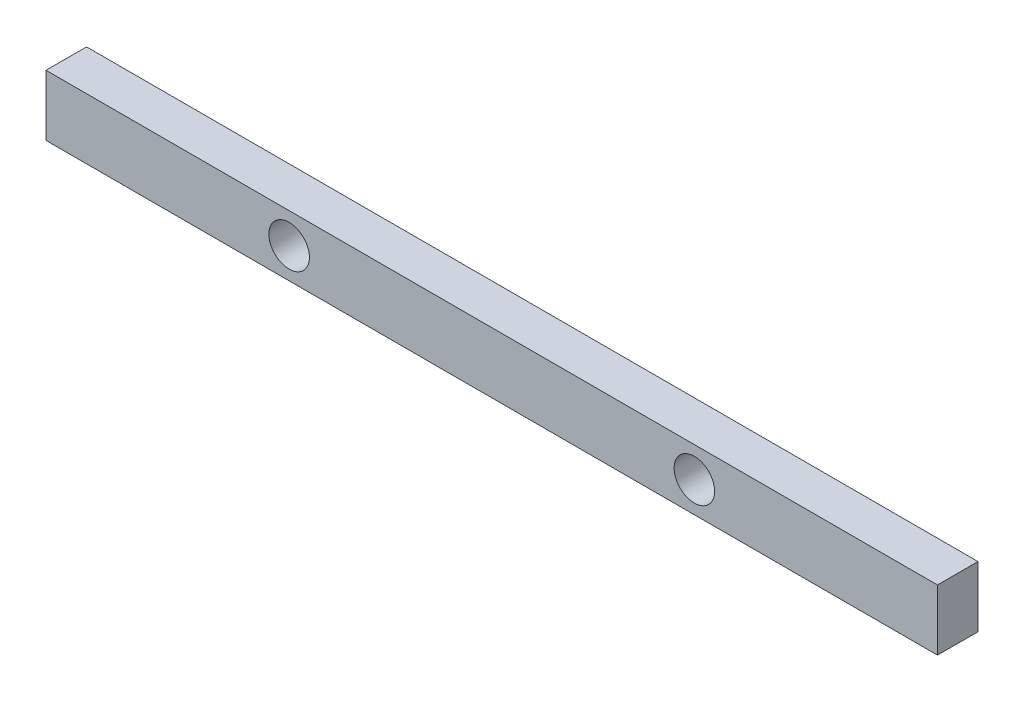
ISO-10303-21;
HEADER;
FILE_DESCRIPTION(('STEP AP214'),'2;1');
FILE_NAME('part.step','',(''),(''),'','','');
FILE_SCHEMA(('AUTOMOTIVE_DESIGN { 1 0 10303 214 1 1 1 1 }'));
ENDSEC;
DATA;
#1=APPLICATION_CONTEXT('core data for automotive mechanical design processes');
#2=APPLICATION_PROTOCOL_DEFINITION('international standard','automotive_design',2000,#1);
#3=PRODUCT_CONTEXT('',#1,'mechanical');
#4=PRODUCT('Part','Part','',(#3));
#5=PRODUCT_RELATED_PRODUCT_CATEGORY('part','',(#4));
#6=PRODUCT_DEFINITION_FORMATION('','',#4);
#7=PRODUCT_DEFINITION_CONTEXT('part definition',#1,'design');
#8=PRODUCT_DEFINITION('design','',#6,#7);
#9=PRODUCT_DEFINITION_SHAPE('','',#8);
#10=(LENGTH_UNIT() NAMED_UNIT(*) SI_UNIT(.MILLI.,.METRE.));
#11=(NAMED_UNIT(*) PLANE_ANGLE_UNIT() SI_UNIT($,.RADIAN.));
#12=(NAMED_UNIT(*) SI_UNIT($,.STERADIAN.) SOLID_ANGLE_UNIT());
#13=UNCERTAINTY_MEASURE_WITH_UNIT(LENGTH_MEASURE(1.E-05),#10,'distance_accuracy_value','');
#14=(GEOMETRIC_REPRESENTATION_CONTEXT(3) GLOBAL_UNCERTAINTY_ASSIGNED_CONTEXT((#13)) GLOBAL_UNIT_ASSIGNED_CONTEXT((#10,
#11,#12)) REPRESENTATION_CONTEXT('',''));
#15=CARTESIAN_POINT('',(0.,0.,0.));
#16=DIRECTION('',(0.,0.,1.));
#17=DIRECTION('',(1.,0.,0.));
#18=AXIS2_PLACEMENT_3D('',#15,#16,#17);
#19=CARTESIAN_POINT('',(0.,0.,2.));
#20=DIRECTION('',(0.,0.,1.));
#21=DIRECTION('',(1.,0.,0.));
#22=AXIS2_PLACEMENT_3D('',#19,#20,#21);
#23=PLANE('',#22);
#24=CARTESIAN_POINT('',(-10.,0.,2.));
#25=DIRECTION('',(0.,0.,1.));
#26=DIRECTION('',(1.,0.,0.));
#27=AXIS2_PLACEMENT_3D('',#24,#25,#26);
#28=CIRCLE('',#27,1.);
#29=CARTESIAN_POINT('',(-9.,0.,2.));
#30=VERTEX_POINT('',#29);
#31=EDGE_CURVE('E101',#30,#30,#28,.T.);
#32=ORIENTED_EDGE('',*,*,#31,.F.);
#33=EDGE_LOOP('',(#32));
#34=FACE_BOUND('',#33,.T.);
#35=DIRECTION('',(0.,1.,0.));
#36=VECTOR('',#35,1.);
#37=CARTESIAN_POINT('',(22.,1.5,2.));
#38=LINE('',#37,#36);
#39=CARTESIAN_POINT('',(22.,-1.5,2.));
#40=VERTEX_POINT('',#39);
#41=CARTESIAN_POINT('',(22.,1.5,2.));
#42=VERTEX_POINT('',#41);
#43=EDGE_CURVE('E86',#40,#42,#38,.T.);
#44=ORIENTED_EDGE('',*,*,#43,.T.);
#45=DIRECTION('',(-1.,0.,0.));
#46=VECTOR('',#45,1.);
#47=CARTESIAN_POINT('',(-22.,1.5,2.));
#48=LINE('',#47,#46);
#49=CARTESIAN_POINT('',(-22.,1.5,2.));
#50=VERTEX_POINT('',#49);
#51=EDGE_CURVE('E81',#42,#50,#48,.T.);
#52=ORIENTED_EDGE('',*,*,#51,.T.);
#53=DIRECTION('',(0.,-1.,0.));
#54=VECTOR('',#53,1.);
#55=CARTESIAN_POINT('',(-22.,1.5,2.));
#56=LINE('',#55,#54);
#57=CARTESIAN_POINT('',(-22.,-1.5,2.));
#58=VERTEX_POINT('',#57);
#59=EDGE_CURVE('E84',#50,#58,#56,.T.);
#60=ORIENTED_EDGE('',*,*,#59,.T.);
#61=DIRECTION('',(1.,0.,0.));
#62=VECTOR('',#61,1.);
#63=CARTESIAN_POINT('',(-22.,-1.5,2.));
#64=LINE('',#63,#62);
#65=EDGE_CURVE('E51',#58,#40,#64,.T.);
#66=ORIENTED_EDGE('',*,*,#65,.T.);
#67=EDGE_LOOP('',(#44,#52,#60,#66));
#68=FACE_BOUND('',#67,.T.);
#69=CARTESIAN_POINT('',(10.,0.,2.));
#70=DIRECTION('',(0.,0.,1.));
#71=DIRECTION('',(1.,0.,0.));
#72=AXIS2_PLACEMENT_3D('',#69,#70,#71);
#73=CIRCLE('',#72,1.);
#74=CARTESIAN_POINT('',(11.,0.,2.));
#75=VERTEX_POINT('',#74);
#76=EDGE_CURVE('E116',#75,#75,#73,.T.);
#77=ORIENTED_EDGE('',*,*,#76,.F.);
#78=EDGE_LOOP('',(#77));
#79=FACE_BOUND('',#78,.T.);
#80=ADVANCED_FACE('F34',(#34,#68,#79),#23,.T.);
#81=CARTESIAN_POINT('',(0.,0.,0.));
#82=DIRECTION('',(0.,0.,1.));
#83=DIRECTION('',(1.,0.,0.));
#84=AXIS2_PLACEMENT_3D('',#81,#82,#83);
#85=PLANE('',#84);
#86=DIRECTION('',(0.,1.,0.));
#87=VECTOR('',#86,1.);
#88=CARTESIAN_POINT('',(22.,1.5,0.));
#89=LINE('',#88,#87);
#90=CARTESIAN_POINT('',(22.,-1.5,0.));
#91=VERTEX_POINT('',#90);
#92=CARTESIAN_POINT('',(22.,1.5,0.));
#93=VERTEX_POINT('',#92);
#94=EDGE_CURVE('E98',#91,#93,#89,.T.);
#95=ORIENTED_EDGE('',*,*,#94,.F.);
#96=DIRECTION('',(1.,0.,0.));
#97=VECTOR('',#96,1.);
#98=CARTESIAN_POINT('',(-22.,-1.5,0.));
#99=LINE('',#98,#97);
#100=CARTESIAN_POINT('',(-22.,-1.5,0.));
#101=VERTEX_POINT('',#100);
#102=EDGE_CURVE('E74',#101,#91,#99,.T.);
#103=ORIENTED_EDGE('',*,*,#102,.F.);
#104=DIRECTION('',(0.,-1.,0.));
#105=VECTOR('',#104,1.);
#106=CARTESIAN_POINT('',(-22.,1.5,0.));
#107=LINE('',#106,#105);
#108=CARTESIAN_POINT('',(-22.,1.5,0.));
#109=VERTEX_POINT('',#108);
#110=EDGE_CURVE('E68',#109,#101,#107,.T.);
#111=ORIENTED_EDGE('',*,*,#110,.F.);
#112=DIRECTION('',(-1.,0.,0.));
#113=VECTOR('',#112,1.);
#114=CARTESIAN_POINT('',(-22.,1.5,0.));
#115=LINE('',#114,#113);
#116=EDGE_CURVE('E90',#93,#109,#115,.T.);
#117=ORIENTED_EDGE('',*,*,#116,.F.);
#118=EDGE_LOOP('',(#95,#103,#111,#117));
#119=FACE_BOUND('',#118,.T.);
#120=CARTESIAN_POINT('',(-10.,0.,0.));
#121=DIRECTION('',(0.,0.,1.));
#122=DIRECTION('',(1.,0.,0.));
#123=AXIS2_PLACEMENT_3D('',#120,#121,#122);
#124=CIRCLE('',#123,1.);
#125=CARTESIAN_POINT('',(-9.,0.,0.));
#126=VERTEX_POINT('',#125);
#127=EDGE_CURVE('E113',#126,#126,#124,.T.);
#128=ORIENTED_EDGE('',*,*,#127,.T.);
#129=EDGE_LOOP('',(#128));
#130=FACE_BOUND('',#129,.T.);
#131=CARTESIAN_POINT('',(10.,0.,0.));
#132=DIRECTION('',(0.,0.,1.));
#133=DIRECTION('',(1.,0.,0.));
#134=AXIS2_PLACEMENT_3D('',#131,#132,#133);
#135=CIRCLE('',#134,1.);
#136=CARTESIAN_POINT('',(11.,0.,0.));
#137=VERTEX_POINT('',#136);
#138=EDGE_CURVE('E119',#137,#137,#135,.T.);
#139=ORIENTED_EDGE('',*,*,#138,.T.);
#140=EDGE_LOOP('',(#139));
#141=FACE_BOUND('',#140,.T.);
#142=ADVANCED_FACE('F109',(#119,#130,#141),#85,.F.);
#143=CARTESIAN_POINT('',(22.,1.5,2.));
#144=DIRECTION('',(-1.,0.,0.));
#145=DIRECTION('',(0.,0.,1.));
#146=AXIS2_PLACEMENT_3D('',#143,#144,#145);
#147=PLANE('',#146);
#148=ORIENTED_EDGE('',*,*,#94,.T.);
#149=DIRECTION('',(0.,0.,-1.));
#150=VECTOR('',#149,1.);
#151=CARTESIAN_POINT('',(22.,1.5,2.));
#152=LINE('',#151,#150);
#153=EDGE_CURVE('E11',#42,#93,#152,.T.);
#154=ORIENTED_EDGE('',*,*,#153,.F.);
#155=ORIENTED_EDGE('',*,*,#43,.F.);
#156=DIRECTION('',(0.,0.,-1.));
#157=VECTOR('',#156,1.);
#158=CARTESIAN_POINT('',(22.,-1.5,2.));
#159=LINE('',#158,#157);
#160=EDGE_CURVE('E94',#40,#91,#159,.T.);
#161=ORIENTED_EDGE('',*,*,#160,.T.);
#162=EDGE_LOOP('',(#148,#154,#155,#161));
#163=FACE_BOUND('',#162,.T.);
#164=ADVANCED_FACE('F36',(#163),#147,.F.);
#165=CARTESIAN_POINT('',(-22.,1.5,2.));
#166=DIRECTION('',(0.,-1.,0.));
#167=DIRECTION('',(0.,0.,-1.));
#168=AXIS2_PLACEMENT_3D('',#165,#166,#167);
#169=PLANE('',#168);
#170=ORIENTED_EDGE('',*,*,#116,.T.);
#171=DIRECTION('',(0.,0.,-1.));
#172=VECTOR('',#171,1.);
#173=CARTESIAN_POINT('',(-22.,1.5,2.));
#174=LINE('',#173,#172);
#175=EDGE_CURVE('E43',#50,#109,#174,.T.);
#176=ORIENTED_EDGE('',*,*,#175,.F.);
#177=ORIENTED_EDGE('',*,*,#51,.F.);
#178=ORIENTED_EDGE('',*,*,#153,.T.);
#179=EDGE_LOOP('',(#170,#176,#177,#178));
#180=FACE_BOUND('',#179,.T.);
#181=ADVANCED_FACE('F89',(#180),#169,.F.);
#182=CARTESIAN_POINT('',(-22.,1.5,2.));
#183=DIRECTION('',(1.,0.,0.));
#184=DIRECTION('',(0.,0.,-1.));
#185=AXIS2_PLACEMENT_3D('',#182,#183,#184);
#186=PLANE('',#185);
#187=ORIENTED_EDGE('',*,*,#110,.T.);
#188=DIRECTION('',(0.,0.,-1.));
#189=VECTOR('',#188,1.);
#190=CARTESIAN_POINT('',(-22.,-1.5,2.));
#191=LINE('',#190,#189);
#192=EDGE_CURVE('E91',#58,#101,#191,.T.);
#193=ORIENTED_EDGE('',*,*,#192,.F.);
#194=ORIENTED_EDGE('',*,*,#59,.F.);
#195=ORIENTED_EDGE('',*,*,#175,.T.);
#196=EDGE_LOOP('',(#187,#193,#194,#195));
#197=FACE_BOUND('',#196,.T.);
#198=ADVANCED_FACE('F92',(#197),#186,.F.);
#199=CARTESIAN_POINT('',(-22.,-1.5,2.));
#200=DIRECTION('',(0.,1.,0.));
#201=DIRECTION('',(0.,0.,1.));
#202=AXIS2_PLACEMENT_3D('',#199,#200,#201);
#203=PLANE('',#202);
#204=ORIENTED_EDGE('',*,*,#102,.T.);
#205=ORIENTED_EDGE('',*,*,#160,.F.);
#206=ORIENTED_EDGE('',*,*,#65,.F.);
#207=ORIENTED_EDGE('',*,*,#192,.T.);
#208=EDGE_LOOP('',(#204,#205,#206,#207));
#209=FACE_BOUND('',#208,.T.);
#210=ADVANCED_FACE('F106',(#209),#203,.F.);
#211=CARTESIAN_POINT('',(-10.,0.,2.));
#212=DIRECTION('',(0.,0.,-1.));
#213=DIRECTION('',(-1.,0.,0.));
#214=AXIS2_PLACEMENT_3D('',#211,#212,#213);
#215=CYLINDRICAL_SURFACE('',#214,1.);
#216=ORIENTED_EDGE('',*,*,#31,.T.);
#217=EDGE_LOOP('',(#216));
#218=FACE_BOUND('',#217,.T.);
#219=ORIENTED_EDGE('',*,*,#127,.F.);
#220=EDGE_LOOP('',(#219));
#221=FACE_BOUND('',#220,.T.);
#222=ADVANCED_FACE('F136',(#218,#221),#215,.F.);
#223=CARTESIAN_POINT('',(10.,0.,2.));
#224=DIRECTION('',(0.,0.,-1.));
#225=DIRECTION('',(-1.,0.,0.));
#226=AXIS2_PLACEMENT_3D('',#223,#224,#225);
#227=CYLINDRICAL_SURFACE('',#226,1.);
#228=ORIENTED_EDGE('',*,*,#76,.T.);
#229=EDGE_LOOP('',(#228));
#230=FACE_BOUND('',#229,.T.);
#231=ORIENTED_EDGE('',*,*,#138,.F.);
#232=EDGE_LOOP('',(#231));
#233=FACE_BOUND('',#232,.T.);
#234=ADVANCED_FACE('F125',(#230,#233),#227,.F.);
#235=CLOSED_SHELL('',(#80,#142,#164,#181,#198,#210,#222,#234));
#236=MANIFOLD_SOLID_BREP('B2',#235);
#237=ADVANCED_BREP_SHAPE_REPRESENTATION('',(#18,#236),#14);
#238=SHAPE_DEFINITION_REPRESENTATION(#9,#237);
ENDSEC;
END-ISO-10303-21;
